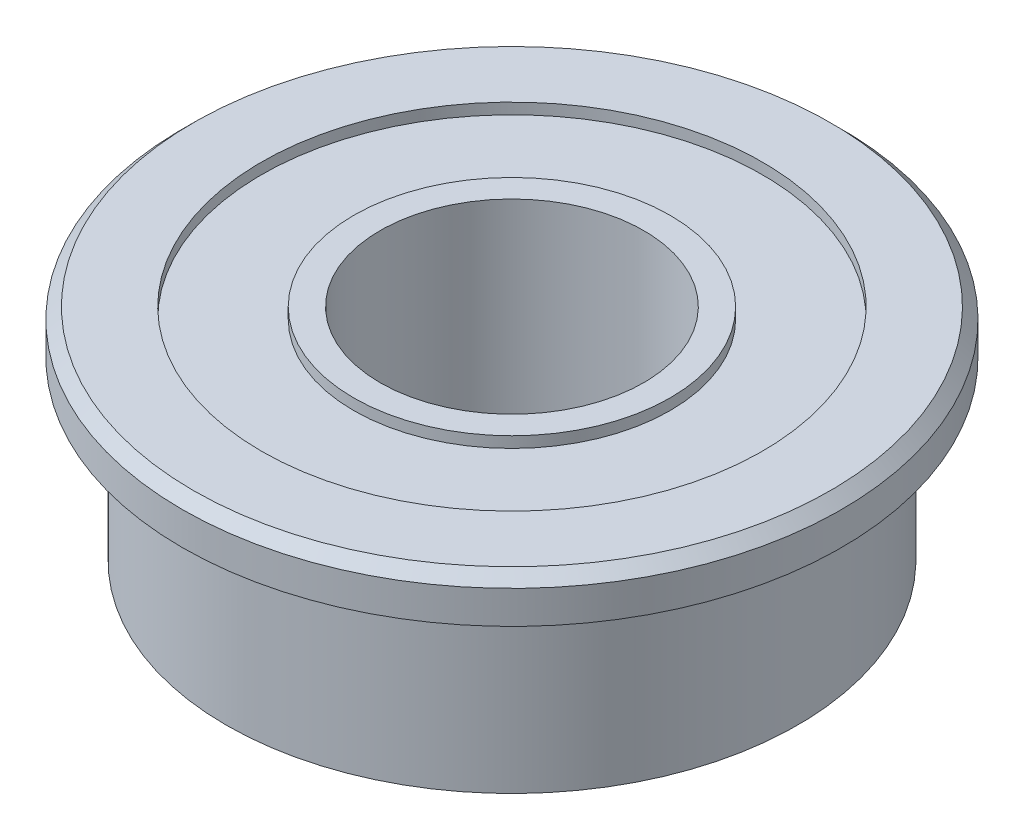
ISO-10303-21;
HEADER;
FILE_DESCRIPTION(('STEP AP214'),'2;1');
FILE_NAME('part.step','',(''),(''),'','','');
FILE_SCHEMA(('AUTOMOTIVE_DESIGN { 1 0 10303 214 1 1 1 1 }'));
ENDSEC;
DATA;
#1=APPLICATION_CONTEXT('core data for automotive mechanical design processes');
#2=APPLICATION_PROTOCOL_DEFINITION('international standard','automotive_design',2000,#1);
#3=PRODUCT_CONTEXT('',#1,'mechanical');
#4=PRODUCT('Part','Part','',(#3));
#5=PRODUCT_RELATED_PRODUCT_CATEGORY('part','',(#4));
#6=PRODUCT_DEFINITION_FORMATION('','',#4);
#7=PRODUCT_DEFINITION_CONTEXT('part definition',#1,'design');
#8=PRODUCT_DEFINITION('design','',#6,#7);
#9=PRODUCT_DEFINITION_SHAPE('','',#8);
#10=(LENGTH_UNIT() NAMED_UNIT(*) SI_UNIT(.MILLI.,.METRE.));
#11=(NAMED_UNIT(*) PLANE_ANGLE_UNIT() SI_UNIT($,.RADIAN.));
#12=(NAMED_UNIT(*) SI_UNIT($,.STERADIAN.) SOLID_ANGLE_UNIT());
#13=UNCERTAINTY_MEASURE_WITH_UNIT(LENGTH_MEASURE(1.E-05),#10,'distance_accuracy_value','');
#14=(GEOMETRIC_REPRESENTATION_CONTEXT(3) GLOBAL_UNCERTAINTY_ASSIGNED_CONTEXT((#13)) GLOBAL_UNIT_ASSIGNED_CONTEXT((#10,
#11,#12)) REPRESENTATION_CONTEXT('',''));
#15=CARTESIAN_POINT('',(0.,0.,0.));
#16=DIRECTION('',(0.,0.,1.));
#17=DIRECTION('',(1.,0.,0.));
#18=AXIS2_PLACEMENT_3D('',#15,#16,#17);
#19=CARTESIAN_POINT('',(0.,5.,0.));
#20=DIRECTION('',(0.,1.,0.));
#21=DIRECTION('',(0.,0.,1.));
#22=AXIS2_PLACEMENT_3D('',#19,#20,#21);
#23=PLANE('',#22);
#24=CARTESIAN_POINT('',(0.,5.,0.));
#25=DIRECTION('',(0.,1.,0.));
#26=DIRECTION('',(0.,0.,1.));
#27=AXIS2_PLACEMENT_3D('',#24,#25,#26);
#28=CIRCLE('',#27,3.);
#29=CARTESIAN_POINT('',(0.,5.,3.));
#30=VERTEX_POINT('',#29);
#31=EDGE_CURVE('E74',#30,#30,#28,.T.);
#32=ORIENTED_EDGE('',*,*,#31,.F.);
#33=EDGE_LOOP('',(#32));
#34=FACE_BOUND('',#33,.T.);
#35=CARTESIAN_POINT('',(0.,5.,0.));
#36=DIRECTION('',(0.,1.,0.));
#37=DIRECTION('',(0.,0.,1.));
#38=AXIS2_PLACEMENT_3D('',#35,#36,#37);
#39=CIRCLE('',#38,3.6);
#40=CARTESIAN_POINT('',(0.,5.,3.6));
#41=VERTEX_POINT('',#40);
#42=EDGE_CURVE('E96',#41,#41,#39,.T.);
#43=ORIENTED_EDGE('',*,*,#42,.T.);
#44=EDGE_LOOP('',(#43));
#45=FACE_BOUND('',#44,.T.);
#46=ADVANCED_FACE('F47',(#34,#45),#23,.T.);
#47=CARTESIAN_POINT('',(0.,0.,0.));
#48=DIRECTION('',(0.,1.,0.));
#49=DIRECTION('',(0.,0.,1.));
#50=AXIS2_PLACEMENT_3D('',#47,#48,#49);
#51=PLANE('',#50);
#52=CARTESIAN_POINT('',(0.,0.,0.));
#53=DIRECTION('',(0.,1.,0.));
#54=DIRECTION('',(0.,0.,1.));
#55=AXIS2_PLACEMENT_3D('',#52,#53,#54);
#56=CIRCLE('',#55,3.);
#57=CARTESIAN_POINT('',(0.,0.,3.));
#58=VERTEX_POINT('',#57);
#59=EDGE_CURVE('E67',#58,#58,#56,.T.);
#60=ORIENTED_EDGE('',*,*,#59,.T.);
#61=EDGE_LOOP('',(#60));
#62=FACE_BOUND('',#61,.T.);
#63=CARTESIAN_POINT('',(0.,0.,0.));
#64=DIRECTION('',(0.,-1.,0.));
#65=DIRECTION('',(0.,0.,-1.));
#66=AXIS2_PLACEMENT_3D('',#63,#64,#65);
#67=CIRCLE('',#66,3.6);
#68=CARTESIAN_POINT('',(0.,0.,-3.6));
#69=VERTEX_POINT('',#68);
#70=EDGE_CURVE('E84',#69,#69,#67,.T.);
#71=ORIENTED_EDGE('',*,*,#70,.T.);
#72=EDGE_LOOP('',(#71));
#73=FACE_BOUND('',#72,.T.);
#74=ADVANCED_FACE('F137',(#62,#73),#51,.F.);
#75=CARTESIAN_POINT('',(0.,0.,0.));
#76=DIRECTION('',(0.,-1.,0.));
#77=DIRECTION('',(0.,0.,-1.));
#78=AXIS2_PLACEMENT_3D('',#75,#76,#77);
#79=CIRCLE('',#78,5.7);
#80=CARTESIAN_POINT('',(0.,0.,-5.7));
#81=VERTEX_POINT('',#80);
#82=EDGE_CURVE('E78',#81,#81,#79,.T.);
#83=ORIENTED_EDGE('',*,*,#82,.F.);
#84=EDGE_LOOP('',(#83));
#85=FACE_BOUND('',#84,.T.);
#86=CARTESIAN_POINT('',(0.,0.,0.));
#87=DIRECTION('',(0.,1.,0.));
#88=DIRECTION('',(0.,0.,1.));
#89=AXIS2_PLACEMENT_3D('',#86,#87,#88);
#90=CIRCLE('',#89,6.5);
#91=CARTESIAN_POINT('',(0.,0.,6.5));
#92=VERTEX_POINT('',#91);
#93=EDGE_CURVE('E63',#92,#92,#90,.T.);
#94=ORIENTED_EDGE('',*,*,#93,.F.);
#95=EDGE_LOOP('',(#94));
#96=FACE_BOUND('',#95,.T.);
#97=ADVANCED_FACE('F143',(#85,#96),#51,.F.);
#98=CARTESIAN_POINT('',(0.,4.,0.));
#99=DIRECTION('',(0.,-1.,0.));
#100=DIRECTION('',(0.,0.,-1.));
#101=AXIS2_PLACEMENT_3D('',#98,#99,#100);
#102=CYLINDRICAL_SURFACE('',#101,6.5);
#103=CARTESIAN_POINT('',(0.,4.,0.));
#104=DIRECTION('',(0.,1.,0.));
#105=DIRECTION('',(0.,0.,1.));
#106=AXIS2_PLACEMENT_3D('',#103,#104,#105);
#107=CIRCLE('',#106,6.5);
#108=CARTESIAN_POINT('',(0.,4.,6.5));
#109=VERTEX_POINT('',#108);
#110=EDGE_CURVE('E59',#109,#109,#107,.T.);
#111=ORIENTED_EDGE('',*,*,#110,.F.);
#112=EDGE_LOOP('',(#111));
#113=FACE_BOUND('',#112,.T.);
#114=ORIENTED_EDGE('',*,*,#93,.T.);
#115=EDGE_LOOP('',(#114));
#116=FACE_BOUND('',#115,.T.);
#117=ADVANCED_FACE('F132',(#113,#116),#102,.T.);
#118=CARTESIAN_POINT('',(0.,4.,0.));
#119=DIRECTION('',(0.,-1.,0.));
#120=DIRECTION('',(0.,0.,-1.));
#121=AXIS2_PLACEMENT_3D('',#118,#119,#120);
#122=CYLINDRICAL_SURFACE('',#121,3.);
#123=ORIENTED_EDGE('',*,*,#59,.F.);
#124=EDGE_LOOP('',(#123));
#125=FACE_BOUND('',#124,.T.);
#126=ORIENTED_EDGE('',*,*,#31,.T.);
#127=EDGE_LOOP('',(#126));
#128=FACE_BOUND('',#127,.T.);
#129=ADVANCED_FACE('F121',(#125,#128),#122,.F.);
#130=CARTESIAN_POINT('',(0.,5.,0.));
#131=DIRECTION('',(0.,1.,0.));
#132=DIRECTION('',(0.,0.,1.));
#133=AXIS2_PLACEMENT_3D('',#130,#131,#132);
#134=CIRCLE('',#133,7.25);
#135=CARTESIAN_POINT('',(0.,5.,7.25));
#136=VERTEX_POINT('',#135);
#137=EDGE_CURVE('E55',#136,#136,#134,.T.);
#138=ORIENTED_EDGE('',*,*,#137,.T.);
#139=EDGE_LOOP('',(#138));
#140=FACE_BOUND('',#139,.T.);
#141=CARTESIAN_POINT('',(0.,5.,0.));
#142=DIRECTION('',(0.,1.,0.));
#143=DIRECTION('',(0.,0.,1.));
#144=AXIS2_PLACEMENT_3D('',#141,#142,#143);
#145=CIRCLE('',#144,5.7);
#146=CARTESIAN_POINT('',(0.,5.,5.7));
#147=VERTEX_POINT('',#146);
#148=EDGE_CURVE('E90',#147,#147,#145,.T.);
#149=ORIENTED_EDGE('',*,*,#148,.F.);
#150=EDGE_LOOP('',(#149));
#151=FACE_BOUND('',#150,.T.);
#152=ADVANCED_FACE('F118',(#140,#151),#23,.T.);
#153=CARTESIAN_POINT('',(0.,4.,0.));
#154=DIRECTION('',(0.,1.,0.));
#155=DIRECTION('',(0.,0.,1.));
#156=AXIS2_PLACEMENT_3D('',#153,#154,#155);
#157=PLANE('',#156);
#158=ORIENTED_EDGE('',*,*,#110,.T.);
#159=EDGE_LOOP('',(#158));
#160=FACE_BOUND('',#159,.T.);
#161=CARTESIAN_POINT('',(0.,4.,0.));
#162=DIRECTION('',(0.,1.,0.));
#163=DIRECTION('',(0.,0.,1.));
#164=AXIS2_PLACEMENT_3D('',#161,#162,#163);
#165=CIRCLE('',#164,7.5);
#166=CARTESIAN_POINT('',(0.,4.,7.5));
#167=VERTEX_POINT('',#166);
#168=EDGE_CURVE('E71',#167,#167,#165,.T.);
#169=ORIENTED_EDGE('',*,*,#168,.F.);
#170=EDGE_LOOP('',(#169));
#171=FACE_BOUND('',#170,.T.);
#172=ADVANCED_FACE('F120',(#160,#171),#157,.F.);
#173=CARTESIAN_POINT('',(0.,5.,0.));
#174=DIRECTION('',(0.,-1.,0.));
#175=DIRECTION('',(0.,0.,-1.));
#176=AXIS2_PLACEMENT_3D('',#173,#174,#175);
#177=CYLINDRICAL_SURFACE('',#176,7.5);
#178=CARTESIAN_POINT('',(0.,4.75,0.));
#179=DIRECTION('',(0.,1.,0.));
#180=DIRECTION('',(0.,0.,1.));
#181=AXIS2_PLACEMENT_3D('',#178,#179,#180);
#182=CIRCLE('',#181,7.5);
#183=CARTESIAN_POINT('',(0.,4.75,7.5));
#184=VERTEX_POINT('',#183);
#185=EDGE_CURVE('E10',#184,#184,#182,.F.);
#186=ORIENTED_EDGE('',*,*,#185,.T.);
#187=EDGE_LOOP('',(#186));
#188=FACE_BOUND('',#187,.T.);
#189=ORIENTED_EDGE('',*,*,#168,.T.);
#190=EDGE_LOOP('',(#189));
#191=FACE_BOUND('',#190,.T.);
#192=ADVANCED_FACE('F128',(#188,#191),#177,.T.);
#193=CARTESIAN_POINT('',(0.,0.25,0.));
#194=DIRECTION('',(0.,-1.,0.));
#195=DIRECTION('',(0.,0.,-1.));
#196=AXIS2_PLACEMENT_3D('',#193,#194,#195);
#197=CYLINDRICAL_SURFACE('',#196,5.7);
#198=CARTESIAN_POINT('',(0.,0.25,0.));
#199=DIRECTION('',(0.,-1.,0.));
#200=DIRECTION('',(0.,0.,-1.));
#201=AXIS2_PLACEMENT_3D('',#198,#199,#200);
#202=CIRCLE('',#201,5.7);
#203=CARTESIAN_POINT('',(0.,0.25,-5.7));
#204=VERTEX_POINT('',#203);
#205=EDGE_CURVE('E77',#204,#204,#202,.T.);
#206=ORIENTED_EDGE('',*,*,#205,.F.);
#207=EDGE_LOOP('',(#206));
#208=FACE_BOUND('',#207,.T.);
#209=ORIENTED_EDGE('',*,*,#82,.T.);
#210=EDGE_LOOP('',(#209));
#211=FACE_BOUND('',#210,.T.);
#212=ADVANCED_FACE('F160',(#208,#211),#197,.F.);
#213=CARTESIAN_POINT('',(0.,0.25,0.));
#214=DIRECTION('',(0.,-1.,0.));
#215=DIRECTION('',(0.,0.,-1.));
#216=AXIS2_PLACEMENT_3D('',#213,#214,#215);
#217=PLANE('',#216);
#218=CARTESIAN_POINT('',(0.,0.25,0.));
#219=DIRECTION('',(0.,-1.,0.));
#220=DIRECTION('',(0.,0.,-1.));
#221=AXIS2_PLACEMENT_3D('',#218,#219,#220);
#222=CIRCLE('',#221,3.6);
#223=CARTESIAN_POINT('',(0.,0.25,-3.6));
#224=VERTEX_POINT('',#223);
#225=EDGE_CURVE('E81',#224,#224,#222,.T.);
#226=ORIENTED_EDGE('',*,*,#225,.F.);
#227=EDGE_LOOP('',(#226));
#228=FACE_BOUND('',#227,.T.);
#229=ORIENTED_EDGE('',*,*,#205,.T.);
#230=EDGE_LOOP('',(#229));
#231=FACE_BOUND('',#230,.T.);
#232=ADVANCED_FACE('F157',(#228,#231),#217,.T.);
#233=CARTESIAN_POINT('',(0.,0.25,0.));
#234=DIRECTION('',(0.,-1.,0.));
#235=DIRECTION('',(0.,0.,-1.));
#236=AXIS2_PLACEMENT_3D('',#233,#234,#235);
#237=CYLINDRICAL_SURFACE('',#236,3.6);
#238=ORIENTED_EDGE('',*,*,#225,.T.);
#239=EDGE_LOOP('',(#238));
#240=FACE_BOUND('',#239,.T.);
#241=ORIENTED_EDGE('',*,*,#70,.F.);
#242=EDGE_LOOP('',(#241));
#243=FACE_BOUND('',#242,.T.);
#244=ADVANCED_FACE('F114',(#240,#243),#237,.T.);
#245=CARTESIAN_POINT('',(0.,4.75,0.));
#246=DIRECTION('',(0.,1.,0.));
#247=DIRECTION('',(0.,0.,1.));
#248=AXIS2_PLACEMENT_3D('',#245,#246,#247);
#249=CYLINDRICAL_SURFACE('',#248,5.7);
#250=CARTESIAN_POINT('',(0.,4.75,0.));
#251=DIRECTION('',(0.,1.,0.));
#252=DIRECTION('',(0.,0.,1.));
#253=AXIS2_PLACEMENT_3D('',#250,#251,#252);
#254=CIRCLE('',#253,5.7);
#255=CARTESIAN_POINT('',(0.,4.75,5.7));
#256=VERTEX_POINT('',#255);
#257=EDGE_CURVE('E87',#256,#256,#254,.T.);
#258=ORIENTED_EDGE('',*,*,#257,.F.);
#259=EDGE_LOOP('',(#258));
#260=FACE_BOUND('',#259,.T.);
#261=ORIENTED_EDGE('',*,*,#148,.T.);
#262=EDGE_LOOP('',(#261));
#263=FACE_BOUND('',#262,.T.);
#264=ADVANCED_FACE('F108',(#260,#263),#249,.F.);
#265=CARTESIAN_POINT('',(0.,4.75,0.));
#266=DIRECTION('',(0.,1.,0.));
#267=DIRECTION('',(0.,0.,1.));
#268=AXIS2_PLACEMENT_3D('',#265,#266,#267);
#269=PLANE('',#268);
#270=CARTESIAN_POINT('',(0.,4.75,0.));
#271=DIRECTION('',(0.,1.,0.));
#272=DIRECTION('',(0.,0.,1.));
#273=AXIS2_PLACEMENT_3D('',#270,#271,#272);
#274=CIRCLE('',#273,3.6);
#275=CARTESIAN_POINT('',(0.,4.75,3.6));
#276=VERTEX_POINT('',#275);
#277=EDGE_CURVE('E93',#276,#276,#274,.T.);
#278=ORIENTED_EDGE('',*,*,#277,.F.);
#279=EDGE_LOOP('',(#278));
#280=FACE_BOUND('',#279,.T.);
#281=ORIENTED_EDGE('',*,*,#257,.T.);
#282=EDGE_LOOP('',(#281));
#283=FACE_BOUND('',#282,.T.);
#284=ADVANCED_FACE('F105',(#280,#283),#269,.T.);
#285=CARTESIAN_POINT('',(0.,4.75,0.));
#286=DIRECTION('',(0.,1.,0.));
#287=DIRECTION('',(0.,0.,1.));
#288=AXIS2_PLACEMENT_3D('',#285,#286,#287);
#289=CYLINDRICAL_SURFACE('',#288,3.6);
#290=ORIENTED_EDGE('',*,*,#277,.T.);
#291=EDGE_LOOP('',(#290));
#292=FACE_BOUND('',#291,.T.);
#293=ORIENTED_EDGE('',*,*,#42,.F.);
#294=EDGE_LOOP('',(#293));
#295=FACE_BOUND('',#294,.T.);
#296=ADVANCED_FACE('F102',(#292,#295),#289,.T.);
#297=CARTESIAN_POINT('',(0.,5.,0.));
#298=DIRECTION('',(0.,-1.,0.));
#299=DIRECTION('',(0.,0.,-1.));
#300=AXIS2_PLACEMENT_3D('',#297,#298,#299);
#301=CONICAL_SURFACE('',#300,7.25,0.785398163397447);
#302=ORIENTED_EDGE('',*,*,#185,.F.);
#303=EDGE_LOOP('',(#302));
#304=FACE_BOUND('',#303,.T.);
#305=ORIENTED_EDGE('',*,*,#137,.F.);
#306=EDGE_LOOP('',(#305));
#307=FACE_BOUND('',#306,.T.);
#308=ADVANCED_FACE('F50',(#304,#307),#301,.T.);
#309=CLOSED_SHELL('',(#46,#74,#97,#117,#129,#152,#172,#192,#212,#232,#244,#264,#284,#296,#308));
#310=MANIFOLD_SOLID_BREP('B2',#309);
#311=ADVANCED_BREP_SHAPE_REPRESENTATION('',(#18,#310),#14);
#312=SHAPE_DEFINITION_REPRESENTATION(#9,#311);
ENDSEC;
END-ISO-10303-21;
